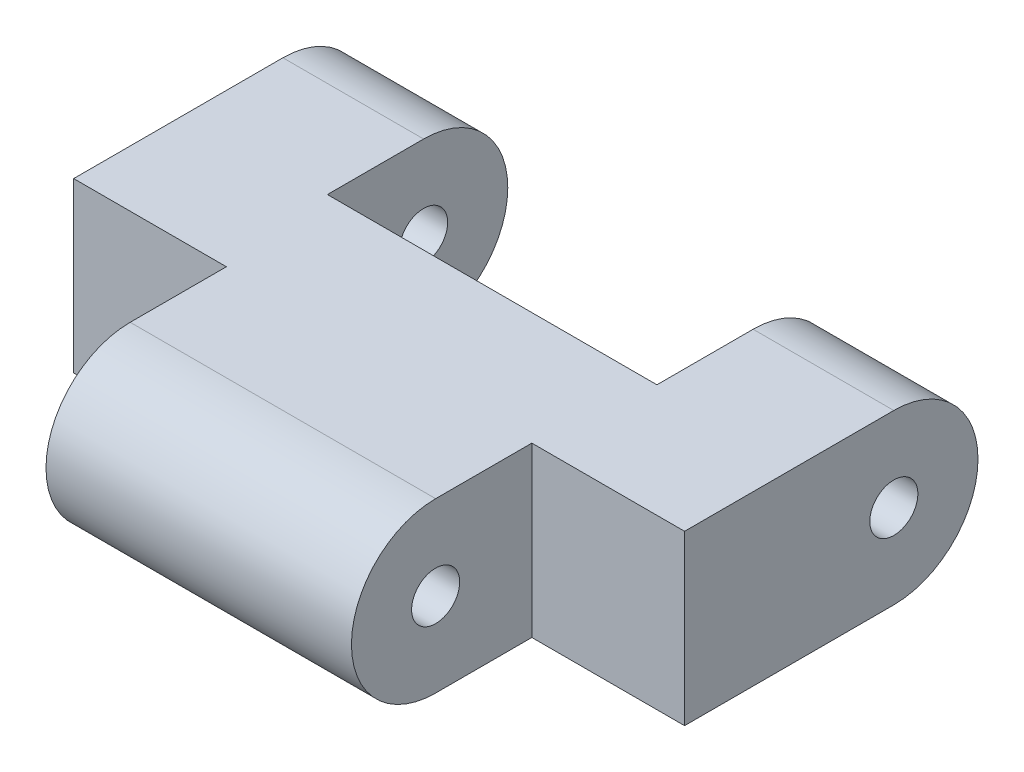
ISO-10303-21;
HEADER;
FILE_DESCRIPTION(('STEP AP214'),'2;1');
FILE_NAME('part.step','',(''),(''),'','','');
FILE_SCHEMA(('AUTOMOTIVE_DESIGN { 1 0 10303 214 1 1 1 1 }'));
ENDSEC;
DATA;
#1=APPLICATION_CONTEXT('core data for automotive mechanical design processes');
#2=APPLICATION_PROTOCOL_DEFINITION('international standard','automotive_design',2000,#1);
#3=PRODUCT_CONTEXT('',#1,'mechanical');
#4=PRODUCT('Part','Part','',(#3));
#5=PRODUCT_RELATED_PRODUCT_CATEGORY('part','',(#4));
#6=PRODUCT_DEFINITION_FORMATION('','',#4);
#7=PRODUCT_DEFINITION_CONTEXT('part definition',#1,'design');
#8=PRODUCT_DEFINITION('design','',#6,#7);
#9=PRODUCT_DEFINITION_SHAPE('','',#8);
#10=(LENGTH_UNIT() NAMED_UNIT(*) SI_UNIT(.MILLI.,.METRE.));
#11=(NAMED_UNIT(*) PLANE_ANGLE_UNIT() SI_UNIT($,.RADIAN.));
#12=(NAMED_UNIT(*) SI_UNIT($,.STERADIAN.) SOLID_ANGLE_UNIT());
#13=UNCERTAINTY_MEASURE_WITH_UNIT(LENGTH_MEASURE(1.E-05),#10,'distance_accuracy_value','');
#14=(GEOMETRIC_REPRESENTATION_CONTEXT(3) GLOBAL_UNCERTAINTY_ASSIGNED_CONTEXT((#13)) GLOBAL_UNIT_ASSIGNED_CONTEXT((#10,
#11,#12)) REPRESENTATION_CONTEXT('',''));
#15=CARTESIAN_POINT('',(0.,0.,0.));
#16=DIRECTION('',(0.,0.,1.));
#17=DIRECTION('',(1.,0.,0.));
#18=AXIS2_PLACEMENT_3D('',#15,#16,#17);
#19=CARTESIAN_POINT('',(12.7,-4.240000074,44.6399999999323));
#20=DIRECTION('',(-1.,0.,0.));
#21=DIRECTION('',(0.,0.,1.));
#22=AXIS2_PLACEMENT_3D('',#19,#20,#21);
#23=CYLINDRICAL_SURFACE('',#22,3.5);
#24=CARTESIAN_POINT('',(-6.35,-4.240000074,44.6399999999323));
#25=DIRECTION('',(1.,0.,0.));
#26=DIRECTION('',(0.,0.,-1.));
#27=AXIS2_PLACEMENT_3D('',#24,#25,#26);
#28=CIRCLE('',#27,3.5);
#29=CARTESIAN_POINT('',(-6.35,-0.740000074000001,44.6399999999323));
#30=VERTEX_POINT('',#29);
#31=CARTESIAN_POINT('',(-6.35,-7.740000074,44.6399999999323));
#32=VERTEX_POINT('',#31);
#33=EDGE_CURVE('E143',#30,#32,#28,.T.);
#34=ORIENTED_EDGE('',*,*,#33,.T.);
#35=DIRECTION('',(-1.,0.,0.));
#36=VECTOR('',#35,1.);
#37=CARTESIAN_POINT('',(12.7,-7.740000074,44.6399999999323));
#38=LINE('',#37,#36);
#39=CARTESIAN_POINT('',(6.35,-7.740000074,44.6399999999323));
#40=VERTEX_POINT('',#39);
#41=EDGE_CURVE('E175',#40,#32,#38,.T.);
#42=ORIENTED_EDGE('',*,*,#41,.F.);
#43=CARTESIAN_POINT('',(6.35,-4.240000074,44.6399999999323));
#44=DIRECTION('',(1.,0.,0.));
#45=DIRECTION('',(0.,0.,-1.));
#46=AXIS2_PLACEMENT_3D('',#43,#44,#45);
#47=CIRCLE('',#46,3.5);
#48=CARTESIAN_POINT('',(6.35,-0.740000074000001,44.6399999999323));
#49=VERTEX_POINT('',#48);
#50=EDGE_CURVE('E265',#49,#40,#47,.T.);
#51=ORIENTED_EDGE('',*,*,#50,.F.);
#52=DIRECTION('',(-1.,0.,0.));
#53=VECTOR('',#52,1.);
#54=CARTESIAN_POINT('',(12.7,-0.740000074000001,44.6399999999323));
#55=LINE('',#54,#53);
#56=EDGE_CURVE('E179',#49,#30,#55,.T.);
#57=ORIENTED_EDGE('',*,*,#56,.T.);
#58=EDGE_LOOP('',(#34,#42,#51,#57));
#59=FACE_BOUND('',#58,.T.);
#60=ADVANCED_FACE('F46',(#59),#23,.T.);
#61=CARTESIAN_POINT('',(12.7,-4.240000074,44.6399999999323));
#62=DIRECTION('',(-1.,0.,0.));
#63=DIRECTION('',(0.,0.,1.));
#64=AXIS2_PLACEMENT_3D('',#61,#62,#63);
#65=CYLINDRICAL_SURFACE('',#64,0.999999999999998);
#66=CARTESIAN_POINT('',(6.35,-4.240000074,44.6399999999323));
#67=DIRECTION('',(1.,0.,0.));
#68=DIRECTION('',(0.,0.,-1.));
#69=AXIS2_PLACEMENT_3D('',#66,#67,#68);
#70=CIRCLE('',#69,0.999999999999998);
#71=CARTESIAN_POINT('',(6.35,-4.240000074,43.6399999999323));
#72=VERTEX_POINT('',#71);
#73=EDGE_CURVE('E271',#72,#72,#70,.T.);
#74=ORIENTED_EDGE('',*,*,#73,.T.);
#75=EDGE_LOOP('',(#74));
#76=FACE_BOUND('',#75,.T.);
#77=CARTESIAN_POINT('',(-6.35,-4.240000074,44.6399999999323));
#78=DIRECTION('',(1.,0.,0.));
#79=DIRECTION('',(0.,0.,-1.));
#80=AXIS2_PLACEMENT_3D('',#77,#78,#79);
#81=CIRCLE('',#80,0.999999999999998);
#82=CARTESIAN_POINT('',(-6.35,-4.240000074,43.6399999999323));
#83=VERTEX_POINT('',#82);
#84=EDGE_CURVE('E289',#83,#83,#81,.T.);
#85=ORIENTED_EDGE('',*,*,#84,.F.);
#86=EDGE_LOOP('',(#85));
#87=FACE_BOUND('',#86,.T.);
#88=ADVANCED_FACE('F297',(#76,#87),#65,.F.);
#89=CARTESIAN_POINT('',(12.7,-0.740000073999996,0.));
#90=DIRECTION('',(0.,-1.,0.));
#91=DIRECTION('',(0.,0.,-1.));
#92=AXIS2_PLACEMENT_3D('',#89,#90,#91);
#93=PLANE('',#92);
#94=DIRECTION('',(1.,0.,0.));
#95=VECTOR('',#94,1.);
#96=CARTESIAN_POINT('',(-12.7,-0.740000074000001,40.6399999999323));
#97=LINE('',#96,#95);
#98=CARTESIAN_POINT('',(-12.7,-0.740000074000001,40.6399999999323));
#99=VERTEX_POINT('',#98);
#100=CARTESIAN_POINT('',(-6.35,-0.740000074000001,40.6399999999323));
#101=VERTEX_POINT('',#100);
#102=EDGE_CURVE('E62',#99,#101,#97,.T.);
#103=ORIENTED_EDGE('',*,*,#102,.T.);
#104=DIRECTION('',(0.,0.,1.));
#105=VECTOR('',#104,1.);
#106=CARTESIAN_POINT('',(-6.35,-0.740000073999996,0.));
#107=LINE('',#106,#105);
#108=EDGE_CURVE('E285',#101,#30,#107,.T.);
#109=ORIENTED_EDGE('',*,*,#108,.T.);
#110=ORIENTED_EDGE('',*,*,#56,.F.);
#111=DIRECTION('',(0.,0.,1.));
#112=VECTOR('',#111,1.);
#113=CARTESIAN_POINT('',(6.35,-0.740000073999996,0.));
#114=LINE('',#113,#112);
#115=CARTESIAN_POINT('',(6.35,-0.740000074000001,40.6399999999323));
#116=VERTEX_POINT('',#115);
#117=EDGE_CURVE('E268',#116,#49,#114,.T.);
#118=ORIENTED_EDGE('',*,*,#117,.F.);
#119=DIRECTION('',(-1.,0.,0.));
#120=VECTOR('',#119,1.);
#121=CARTESIAN_POINT('',(29.075,-0.740000074000001,40.6399999999323));
#122=LINE('',#121,#120);
#123=CARTESIAN_POINT('',(12.7,-0.740000074000001,40.6399999999323));
#124=VERTEX_POINT('',#123);
#125=EDGE_CURVE('E256',#124,#116,#122,.T.);
#126=ORIENTED_EDGE('',*,*,#125,.F.);
#127=DIRECTION('',(0.,0.,1.));
#128=VECTOR('',#127,1.);
#129=CARTESIAN_POINT('',(12.7,-0.740000073999996,0.));
#130=LINE('',#129,#128);
#131=CARTESIAN_POINT('',(12.7,-0.740000074,31.9399999999323));
#132=VERTEX_POINT('',#131);
#133=EDGE_CURVE('E212',#132,#124,#130,.T.);
#134=ORIENTED_EDGE('',*,*,#133,.F.);
#135=DIRECTION('',(-1.,0.,0.));
#136=VECTOR('',#135,1.);
#137=CARTESIAN_POINT('',(12.7,-0.740000074,31.9399999999323));
#138=LINE('',#137,#136);
#139=CARTESIAN_POINT('',(6.85,-0.740000074,31.9399999999323));
#140=VERTEX_POINT('',#139);
#141=EDGE_CURVE('E55',#132,#140,#138,.T.);
#142=ORIENTED_EDGE('',*,*,#141,.T.);
#143=DIRECTION('',(0.,0.,1.));
#144=VECTOR('',#143,1.);
#145=CARTESIAN_POINT('',(6.85,-0.740000073999996,0.));
#146=LINE('',#145,#144);
#147=CARTESIAN_POINT('',(6.85,-0.740000074,35.9399999999323));
#148=VERTEX_POINT('',#147);
#149=EDGE_CURVE('E234',#140,#148,#146,.T.);
#150=ORIENTED_EDGE('',*,*,#149,.T.);
#151=DIRECTION('',(1.,0.,0.));
#152=VECTOR('',#151,1.);
#153=CARTESIAN_POINT('',(-6.85,-0.740000074,35.9399999999323));
#154=LINE('',#153,#152);
#155=CARTESIAN_POINT('',(-6.85,-0.740000074,35.9399999999323));
#156=VERTEX_POINT('',#155);
#157=EDGE_CURVE('E202',#156,#148,#154,.T.);
#158=ORIENTED_EDGE('',*,*,#157,.F.);
#159=DIRECTION('',(0.,0.,1.));
#160=VECTOR('',#159,1.);
#161=CARTESIAN_POINT('',(-6.85,-0.740000073999996,0.));
#162=LINE('',#161,#160);
#163=CARTESIAN_POINT('',(-6.85,-0.740000074,31.9399999999323));
#164=VERTEX_POINT('',#163);
#165=EDGE_CURVE('E194',#164,#156,#162,.T.);
#166=ORIENTED_EDGE('',*,*,#165,.F.);
#167=CARTESIAN_POINT('',(-12.7,-0.740000074,31.9399999999323));
#168=VERTEX_POINT('',#167);
#169=EDGE_CURVE('E182',#164,#168,#138,.T.);
#170=ORIENTED_EDGE('',*,*,#169,.T.);
#171=DIRECTION('',(0.,0.,1.));
#172=VECTOR('',#171,1.);
#173=CARTESIAN_POINT('',(-12.7,-0.740000073999996,0.));
#174=LINE('',#173,#172);
#175=EDGE_CURVE('E161',#168,#99,#174,.T.);
#176=ORIENTED_EDGE('',*,*,#175,.T.);
#177=EDGE_LOOP('',(#103,#109,#110,#118,#126,#134,#142,#150,#158,#166,#170,#176));
#178=FACE_BOUND('',#177,.T.);
#179=ADVANCED_FACE('F191',(#178),#93,.F.);
#180=CARTESIAN_POINT('',(12.7,-7.74000007400001,0.));
#181=DIRECTION('',(0.,1.,0.));
#182=DIRECTION('',(0.,0.,1.));
#183=AXIS2_PLACEMENT_3D('',#180,#181,#182);
#184=PLANE('',#183);
#185=DIRECTION('',(1.,0.,0.));
#186=VECTOR('',#185,1.);
#187=CARTESIAN_POINT('',(-12.7,-7.740000074,40.6399999999323));
#188=LINE('',#187,#186);
#189=CARTESIAN_POINT('',(-12.7,-7.740000074,40.6399999999323));
#190=VERTEX_POINT('',#189);
#191=CARTESIAN_POINT('',(-6.35,-7.740000074,40.6399999999323));
#192=VERTEX_POINT('',#191);
#193=EDGE_CURVE('E136',#190,#192,#188,.T.);
#194=ORIENTED_EDGE('',*,*,#193,.F.);
#195=DIRECTION('',(0.,0.,-1.));
#196=VECTOR('',#195,1.);
#197=CARTESIAN_POINT('',(-12.7,-7.74000007400001,0.));
#198=LINE('',#197,#196);
#199=CARTESIAN_POINT('',(-12.7,-7.740000074,31.9399999999323));
#200=VERTEX_POINT('',#199);
#201=EDGE_CURVE('E149',#190,#200,#198,.T.);
#202=ORIENTED_EDGE('',*,*,#201,.T.);
#203=DIRECTION('',(-1.,0.,0.));
#204=VECTOR('',#203,1.);
#205=CARTESIAN_POINT('',(12.7,-7.740000074,31.9399999999323));
#206=LINE('',#205,#204);
#207=CARTESIAN_POINT('',(-6.85,-7.740000074,31.9399999999323));
#208=VERTEX_POINT('',#207);
#209=EDGE_CURVE('E176',#208,#200,#206,.T.);
#210=ORIENTED_EDGE('',*,*,#209,.F.);
#211=DIRECTION('',(0.,0.,-1.));
#212=VECTOR('',#211,1.);
#213=CARTESIAN_POINT('',(-6.85,-7.74000007400001,0.));
#214=LINE('',#213,#212);
#215=CARTESIAN_POINT('',(-6.85,-7.740000074,35.9399999999323));
#216=VERTEX_POINT('',#215);
#217=EDGE_CURVE('E243',#216,#208,#214,.T.);
#218=ORIENTED_EDGE('',*,*,#217,.F.);
#219=DIRECTION('',(1.,0.,0.));
#220=VECTOR('',#219,1.);
#221=CARTESIAN_POINT('',(-6.85,-7.740000074,35.9399999999323));
#222=LINE('',#221,#220);
#223=CARTESIAN_POINT('',(6.85,-7.740000074,35.9399999999323));
#224=VERTEX_POINT('',#223);
#225=EDGE_CURVE('E199',#216,#224,#222,.T.);
#226=ORIENTED_EDGE('',*,*,#225,.T.);
#227=DIRECTION('',(0.,0.,-1.));
#228=VECTOR('',#227,1.);
#229=CARTESIAN_POINT('',(6.85,-7.74000007400001,0.));
#230=LINE('',#229,#228);
#231=CARTESIAN_POINT('',(6.85,-7.740000074,31.9399999999323));
#232=VERTEX_POINT('',#231);
#233=EDGE_CURVE('E227',#224,#232,#230,.T.);
#234=ORIENTED_EDGE('',*,*,#233,.T.);
#235=CARTESIAN_POINT('',(12.7,-7.740000074,31.9399999999323));
#236=VERTEX_POINT('',#235);
#237=EDGE_CURVE('E171',#236,#232,#206,.T.);
#238=ORIENTED_EDGE('',*,*,#237,.F.);
#239=DIRECTION('',(0.,0.,-1.));
#240=VECTOR('',#239,1.);
#241=CARTESIAN_POINT('',(12.7,-7.74000007400001,0.));
#242=LINE('',#241,#240);
#243=CARTESIAN_POINT('',(12.7,-7.740000074,40.6399999999323));
#244=VERTEX_POINT('',#243);
#245=EDGE_CURVE('E209',#244,#236,#242,.T.);
#246=ORIENTED_EDGE('',*,*,#245,.F.);
#247=DIRECTION('',(-1.,0.,0.));
#248=VECTOR('',#247,1.);
#249=CARTESIAN_POINT('',(29.075,-7.740000074,40.6399999999323));
#250=LINE('',#249,#248);
#251=CARTESIAN_POINT('',(6.35,-7.740000074,40.6399999999323));
#252=VERTEX_POINT('',#251);
#253=EDGE_CURVE('E69',#244,#252,#250,.T.);
#254=ORIENTED_EDGE('',*,*,#253,.T.);
#255=DIRECTION('',(0.,0.,-1.));
#256=VECTOR('',#255,1.);
#257=CARTESIAN_POINT('',(6.35,-7.74000007400001,0.));
#258=LINE('',#257,#256);
#259=EDGE_CURVE('E262',#40,#252,#258,.T.);
#260=ORIENTED_EDGE('',*,*,#259,.F.);
#261=ORIENTED_EDGE('',*,*,#41,.T.);
#262=DIRECTION('',(0.,0.,-1.));
#263=VECTOR('',#262,1.);
#264=CARTESIAN_POINT('',(-6.35,-7.74000007400001,0.));
#265=LINE('',#264,#263);
#266=EDGE_CURVE('E152',#32,#192,#265,.T.);
#267=ORIENTED_EDGE('',*,*,#266,.T.);
#268=EDGE_LOOP('',(#194,#202,#210,#218,#226,#234,#238,#246,#254,#260,#261,#267));
#269=FACE_BOUND('',#268,.T.);
#270=ADVANCED_FACE('F147',(#269),#184,.F.);
#271=CARTESIAN_POINT('',(-12.7,0.,0.));
#272=DIRECTION('',(1.,0.,0.));
#273=DIRECTION('',(0.,0.,-1.));
#274=AXIS2_PLACEMENT_3D('',#271,#272,#273);
#275=PLANE('',#274);
#276=CARTESIAN_POINT('',(-12.7,-4.240000074,31.9399999999323));
#277=DIRECTION('',(1.,0.,0.));
#278=DIRECTION('',(0.,0.,-1.));
#279=AXIS2_PLACEMENT_3D('',#276,#277,#278);
#280=CIRCLE('',#279,0.999999999999998);
#281=CARTESIAN_POINT('',(-12.7,-4.240000074,30.9399999999323));
#282=VERTEX_POINT('',#281);
#283=EDGE_CURVE('E160',#282,#282,#280,.T.);
#284=ORIENTED_EDGE('',*,*,#283,.T.);
#285=EDGE_LOOP('',(#284));
#286=FACE_BOUND('',#285,.T.);
#287=DIRECTION('',(0.,-1.,0.));
#288=VECTOR('',#287,1.);
#289=CARTESIAN_POINT('',(-12.7,0.,40.6399999999323));
#290=LINE('',#289,#288);
#291=EDGE_CURVE('E133',#99,#190,#290,.T.);
#292=ORIENTED_EDGE('',*,*,#291,.F.);
#293=ORIENTED_EDGE('',*,*,#175,.F.);
#294=CARTESIAN_POINT('',(-12.7,-4.240000074,31.9399999999323));
#295=DIRECTION('',(1.,0.,0.));
#296=DIRECTION('',(0.,0.,-1.));
#297=AXIS2_PLACEMENT_3D('',#294,#295,#296);
#298=CIRCLE('',#297,3.5);
#299=EDGE_CURVE('E158',#168,#200,#298,.F.);
#300=ORIENTED_EDGE('',*,*,#299,.T.);
#301=ORIENTED_EDGE('',*,*,#201,.F.);
#302=EDGE_LOOP('',(#292,#293,#300,#301));
#303=FACE_BOUND('',#302,.T.);
#304=ADVANCED_FACE('F156',(#286,#303),#275,.F.);
#305=CARTESIAN_POINT('',(12.7,-4.240000074,31.9399999999323));
#306=DIRECTION('',(-1.,0.,0.));
#307=DIRECTION('',(0.,0.,1.));
#308=AXIS2_PLACEMENT_3D('',#305,#306,#307);
#309=CYLINDRICAL_SURFACE('',#308,3.5);
#310=ORIENTED_EDGE('',*,*,#169,.F.);
#311=CARTESIAN_POINT('',(-6.85,-4.240000074,31.9399999999323));
#312=DIRECTION('',(1.,0.,0.));
#313=DIRECTION('',(0.,0.,-1.));
#314=AXIS2_PLACEMENT_3D('',#311,#312,#313);
#315=CIRCLE('',#314,3.5);
#316=EDGE_CURVE('E226',#164,#208,#315,.F.);
#317=ORIENTED_EDGE('',*,*,#316,.T.);
#318=ORIENTED_EDGE('',*,*,#209,.T.);
#319=ORIENTED_EDGE('',*,*,#299,.F.);
#320=EDGE_LOOP('',(#310,#317,#318,#319));
#321=FACE_BOUND('',#320,.T.);
#322=ADVANCED_FACE('F197',(#321),#309,.T.);
#323=CARTESIAN_POINT('',(12.7,-4.240000074,31.9399999999323));
#324=DIRECTION('',(-1.,0.,0.));
#325=DIRECTION('',(0.,0.,1.));
#326=AXIS2_PLACEMENT_3D('',#323,#324,#325);
#327=CYLINDRICAL_SURFACE('',#326,0.999999999999998);
#328=ORIENTED_EDGE('',*,*,#283,.F.);
#329=EDGE_LOOP('',(#328));
#330=FACE_BOUND('',#329,.T.);
#331=CARTESIAN_POINT('',(-6.85,-4.240000074,31.9399999999323));
#332=DIRECTION('',(1.,0.,0.));
#333=DIRECTION('',(0.,0.,-1.));
#334=AXIS2_PLACEMENT_3D('',#331,#332,#333);
#335=CIRCLE('',#334,0.999999999999998);
#336=CARTESIAN_POINT('',(-6.85,-4.240000074,30.9399999999323));
#337=VERTEX_POINT('',#336);
#338=EDGE_CURVE('E220',#337,#337,#335,.T.);
#339=ORIENTED_EDGE('',*,*,#338,.T.);
#340=EDGE_LOOP('',(#339));
#341=FACE_BOUND('',#340,.T.);
#342=ADVANCED_FACE('F315',(#330,#341),#327,.F.);
#343=CARTESIAN_POINT('',(6.85,-4.240000074,31.9399999999323));
#344=DIRECTION('',(1.,0.,0.));
#345=DIRECTION('',(0.,0.,-1.));
#346=AXIS2_PLACEMENT_3D('',#343,#344,#345);
#347=CIRCLE('',#346,3.5);
#348=EDGE_CURVE('E237',#140,#232,#347,.F.);
#349=ORIENTED_EDGE('',*,*,#348,.F.);
#350=ORIENTED_EDGE('',*,*,#141,.F.);
#351=CARTESIAN_POINT('',(12.7,-4.240000074,31.9399999999323));
#352=DIRECTION('',(1.,0.,0.));
#353=DIRECTION('',(0.,0.,-1.));
#354=AXIS2_PLACEMENT_3D('',#351,#352,#353);
#355=CIRCLE('',#354,3.5);
#356=EDGE_CURVE('E166',#132,#236,#355,.F.);
#357=ORIENTED_EDGE('',*,*,#356,.T.);
#358=ORIENTED_EDGE('',*,*,#237,.T.);
#359=EDGE_LOOP('',(#349,#350,#357,#358));
#360=FACE_BOUND('',#359,.T.);
#361=ADVANCED_FACE('F48',(#360),#309,.T.);
#362=CARTESIAN_POINT('',(6.85,-4.240000074,31.9399999999323));
#363=DIRECTION('',(1.,0.,0.));
#364=DIRECTION('',(0.,0.,-1.));
#365=AXIS2_PLACEMENT_3D('',#362,#363,#364);
#366=CIRCLE('',#365,0.999999999999998);
#367=CARTESIAN_POINT('',(6.85,-4.240000074,30.9399999999323));
#368=VERTEX_POINT('',#367);
#369=EDGE_CURVE('E222',#368,#368,#366,.T.);
#370=ORIENTED_EDGE('',*,*,#369,.F.);
#371=EDGE_LOOP('',(#370));
#372=FACE_BOUND('',#371,.T.);
#373=CARTESIAN_POINT('',(12.7,-4.240000074,31.9399999999323));
#374=DIRECTION('',(1.,0.,0.));
#375=DIRECTION('',(0.,0.,-1.));
#376=AXIS2_PLACEMENT_3D('',#373,#374,#375);
#377=CIRCLE('',#376,0.999999999999998);
#378=CARTESIAN_POINT('',(12.7,-4.240000074,30.9399999999323));
#379=VERTEX_POINT('',#378);
#380=EDGE_CURVE('E205',#379,#379,#377,.T.);
#381=ORIENTED_EDGE('',*,*,#380,.T.);
#382=EDGE_LOOP('',(#381));
#383=FACE_BOUND('',#382,.T.);
#384=ADVANCED_FACE('F310',(#372,#383),#327,.F.);
#385=CARTESIAN_POINT('',(12.7,0.,0.));
#386=DIRECTION('',(1.,0.,0.));
#387=DIRECTION('',(0.,0.,-1.));
#388=AXIS2_PLACEMENT_3D('',#385,#386,#387);
#389=PLANE('',#388);
#390=DIRECTION('',(0.,1.,0.));
#391=VECTOR('',#390,1.);
#392=CARTESIAN_POINT('',(12.7,0.,40.6399999999323));
#393=LINE('',#392,#391);
#394=EDGE_CURVE('E11',#244,#124,#393,.T.);
#395=ORIENTED_EDGE('',*,*,#394,.F.);
#396=ORIENTED_EDGE('',*,*,#245,.T.);
#397=ORIENTED_EDGE('',*,*,#356,.F.);
#398=ORIENTED_EDGE('',*,*,#133,.T.);
#399=EDGE_LOOP('',(#395,#396,#397,#398));
#400=FACE_BOUND('',#399,.T.);
#401=ORIENTED_EDGE('',*,*,#380,.F.);
#402=EDGE_LOOP('',(#401));
#403=FACE_BOUND('',#402,.T.);
#404=ADVANCED_FACE('F313',(#400,#403),#389,.T.);
#405=CARTESIAN_POINT('',(-6.85,0.,35.9399999999323));
#406=DIRECTION('',(0.,0.,1.));
#407=DIRECTION('',(1.,0.,0.));
#408=AXIS2_PLACEMENT_3D('',#405,#406,#407);
#409=PLANE('',#408);
#410=DIRECTION('',(0.,-1.,0.));
#411=VECTOR('',#410,1.);
#412=CARTESIAN_POINT('',(6.85,0.,35.9399999999323));
#413=LINE('',#412,#411);
#414=EDGE_CURVE('E231',#148,#224,#413,.T.);
#415=ORIENTED_EDGE('',*,*,#414,.T.);
#416=ORIENTED_EDGE('',*,*,#225,.F.);
#417=DIRECTION('',(0.,-1.,0.));
#418=VECTOR('',#417,1.);
#419=CARTESIAN_POINT('',(-6.85,0.,35.9399999999323));
#420=LINE('',#419,#418);
#421=EDGE_CURVE('E246',#156,#216,#420,.T.);
#422=ORIENTED_EDGE('',*,*,#421,.F.);
#423=ORIENTED_EDGE('',*,*,#157,.T.);
#424=EDGE_LOOP('',(#415,#416,#422,#423));
#425=FACE_BOUND('',#424,.T.);
#426=ADVANCED_FACE('F333',(#425),#409,.F.);
#427=CARTESIAN_POINT('',(-6.85,0.,0.));
#428=DIRECTION('',(1.,0.,0.));
#429=DIRECTION('',(0.,0.,-1.));
#430=AXIS2_PLACEMENT_3D('',#427,#428,#429);
#431=PLANE('',#430);
#432=ORIENTED_EDGE('',*,*,#316,.F.);
#433=ORIENTED_EDGE('',*,*,#165,.T.);
#434=ORIENTED_EDGE('',*,*,#421,.T.);
#435=ORIENTED_EDGE('',*,*,#217,.T.);
#436=EDGE_LOOP('',(#432,#433,#434,#435));
#437=FACE_BOUND('',#436,.T.);
#438=ORIENTED_EDGE('',*,*,#338,.F.);
#439=EDGE_LOOP('',(#438));
#440=FACE_BOUND('',#439,.T.);
#441=ADVANCED_FACE('F330',(#437,#440),#431,.T.);
#442=CARTESIAN_POINT('',(6.85,0.,0.));
#443=DIRECTION('',(1.,0.,0.));
#444=DIRECTION('',(0.,0.,-1.));
#445=AXIS2_PLACEMENT_3D('',#442,#443,#444);
#446=PLANE('',#445);
#447=ORIENTED_EDGE('',*,*,#348,.T.);
#448=ORIENTED_EDGE('',*,*,#233,.F.);
#449=ORIENTED_EDGE('',*,*,#414,.F.);
#450=ORIENTED_EDGE('',*,*,#149,.F.);
#451=EDGE_LOOP('',(#447,#448,#449,#450));
#452=FACE_BOUND('',#451,.T.);
#453=ORIENTED_EDGE('',*,*,#369,.T.);
#454=EDGE_LOOP('',(#453));
#455=FACE_BOUND('',#454,.T.);
#456=ADVANCED_FACE('F332',(#452,#455),#446,.F.);
#457=CARTESIAN_POINT('',(29.075,0.,40.6399999999323));
#458=DIRECTION('',(0.,0.,-1.));
#459=DIRECTION('',(-1.,0.,0.));
#460=AXIS2_PLACEMENT_3D('',#457,#458,#459);
#461=PLANE('',#460);
#462=ORIENTED_EDGE('',*,*,#394,.T.);
#463=ORIENTED_EDGE('',*,*,#125,.T.);
#464=DIRECTION('',(0.,-1.,0.));
#465=VECTOR('',#464,1.);
#466=CARTESIAN_POINT('',(6.35,0.,40.6399999999323));
#467=LINE('',#466,#465);
#468=EDGE_CURVE('E259',#116,#252,#467,.T.);
#469=ORIENTED_EDGE('',*,*,#468,.T.);
#470=ORIENTED_EDGE('',*,*,#253,.F.);
#471=EDGE_LOOP('',(#462,#463,#469,#470));
#472=FACE_BOUND('',#471,.T.);
#473=ADVANCED_FACE('F340',(#472),#461,.F.);
#474=CARTESIAN_POINT('',(6.35,0.,0.));
#475=DIRECTION('',(1.,0.,0.));
#476=DIRECTION('',(0.,0.,-1.));
#477=AXIS2_PLACEMENT_3D('',#474,#475,#476);
#478=PLANE('',#477);
#479=ORIENTED_EDGE('',*,*,#73,.F.);
#480=EDGE_LOOP('',(#479));
#481=FACE_BOUND('',#480,.T.);
#482=ORIENTED_EDGE('',*,*,#117,.T.);
#483=ORIENTED_EDGE('',*,*,#50,.T.);
#484=ORIENTED_EDGE('',*,*,#259,.T.);
#485=ORIENTED_EDGE('',*,*,#468,.F.);
#486=EDGE_LOOP('',(#482,#483,#484,#485));
#487=FACE_BOUND('',#486,.T.);
#488=ADVANCED_FACE('F366',(#481,#487),#478,.T.);
#489=CARTESIAN_POINT('',(-12.7,0.,40.6399999999323));
#490=DIRECTION('',(0.,0.,1.));
#491=DIRECTION('',(1.,0.,0.));
#492=AXIS2_PLACEMENT_3D('',#489,#490,#491);
#493=PLANE('',#492);
#494=DIRECTION('',(0.,-1.,0.));
#495=VECTOR('',#494,1.);
#496=CARTESIAN_POINT('',(-6.35,0.,40.6399999999323));
#497=LINE('',#496,#495);
#498=EDGE_CURVE('E282',#101,#192,#497,.T.);
#499=ORIENTED_EDGE('',*,*,#498,.F.);
#500=ORIENTED_EDGE('',*,*,#102,.F.);
#501=ORIENTED_EDGE('',*,*,#291,.T.);
#502=ORIENTED_EDGE('',*,*,#193,.T.);
#503=EDGE_LOOP('',(#499,#500,#501,#502));
#504=FACE_BOUND('',#503,.T.);
#505=ADVANCED_FACE('F135',(#504),#493,.T.);
#506=CARTESIAN_POINT('',(-6.35,0.,0.));
#507=DIRECTION('',(-1.,0.,0.));
#508=DIRECTION('',(0.,0.,-1.));
#509=AXIS2_PLACEMENT_3D('',#506,#507,#508);
#510=PLANE('',#509);
#511=ORIENTED_EDGE('',*,*,#84,.T.);
#512=EDGE_LOOP('',(#511));
#513=FACE_BOUND('',#512,.T.);
#514=ORIENTED_EDGE('',*,*,#108,.F.);
#515=ORIENTED_EDGE('',*,*,#498,.T.);
#516=ORIENTED_EDGE('',*,*,#266,.F.);
#517=ORIENTED_EDGE('',*,*,#33,.F.);
#518=EDGE_LOOP('',(#514,#515,#516,#517));
#519=FACE_BOUND('',#518,.T.);
#520=ADVANCED_FACE('F294',(#513,#519),#510,.T.);
#521=CLOSED_SHELL('',(#60,#88,#179,#270,#304,#322,#342,#361,#384,#404,#426,#441,#456,#473,#488,
#505,#520));
#522=MANIFOLD_SOLID_BREP('B2',#521);
#523=ADVANCED_BREP_SHAPE_REPRESENTATION('',(#18,#522),#14);
#524=SHAPE_DEFINITION_REPRESENTATION(#9,#523);
ENDSEC;
END-ISO-10303-21;
